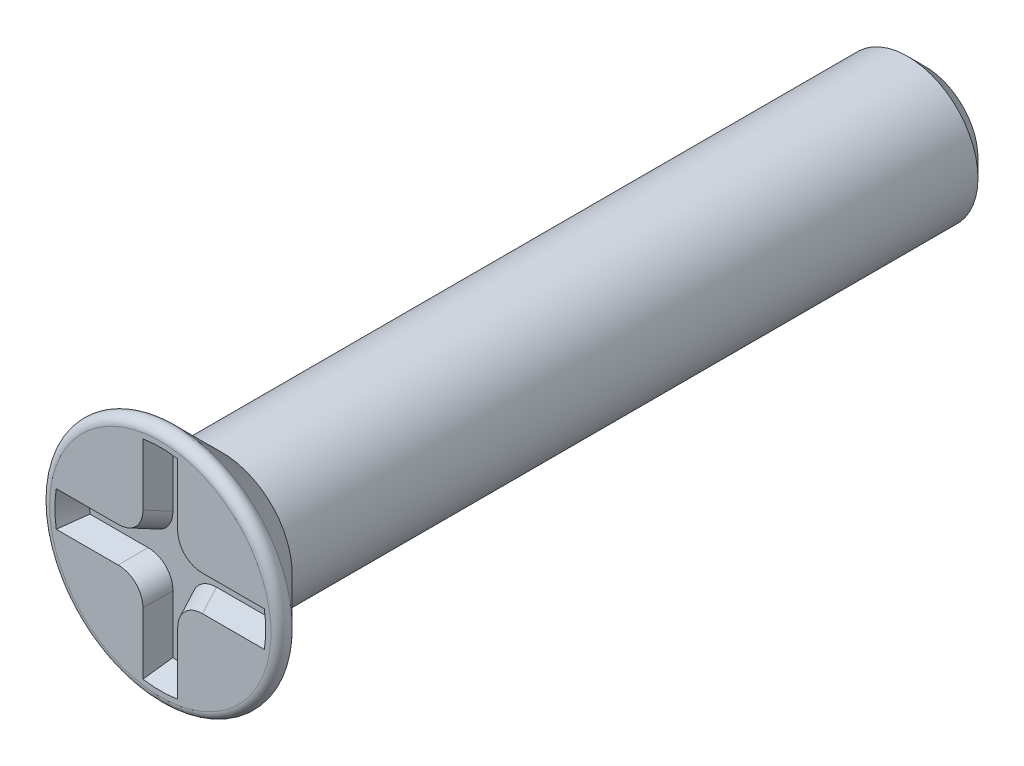
ISO-10303-21;
HEADER;
FILE_DESCRIPTION(('STEP AP214'),'2;1');
FILE_NAME('part.step','',(''),(''),'','','');
FILE_SCHEMA(('AUTOMOTIVE_DESIGN { 1 0 10303 214 1 1 1 1 }'));
ENDSEC;
DATA;
#1=APPLICATION_CONTEXT('core data for automotive mechanical design processes');
#2=APPLICATION_PROTOCOL_DEFINITION('international standard','automotive_design',2000,#1);
#3=PRODUCT_CONTEXT('',#1,'mechanical');
#4=PRODUCT('Part','Part','',(#3));
#5=PRODUCT_RELATED_PRODUCT_CATEGORY('part','',(#4));
#6=PRODUCT_DEFINITION_FORMATION('','',#4);
#7=PRODUCT_DEFINITION_CONTEXT('part definition',#1,'design');
#8=PRODUCT_DEFINITION('design','',#6,#7);
#9=PRODUCT_DEFINITION_SHAPE('','',#8);
#10=(LENGTH_UNIT() NAMED_UNIT(*) SI_UNIT(.MILLI.,.METRE.));
#11=(NAMED_UNIT(*) PLANE_ANGLE_UNIT() SI_UNIT($,.RADIAN.));
#12=(NAMED_UNIT(*) SI_UNIT($,.STERADIAN.) SOLID_ANGLE_UNIT());
#13=UNCERTAINTY_MEASURE_WITH_UNIT(LENGTH_MEASURE(1.E-05),#10,'distance_accuracy_value','');
#14=(GEOMETRIC_REPRESENTATION_CONTEXT(3) GLOBAL_UNCERTAINTY_ASSIGNED_CONTEXT((#13)) GLOBAL_UNIT_ASSIGNED_CONTEXT((#10,
#11,#12)) REPRESENTATION_CONTEXT('',''));
#15=CARTESIAN_POINT('',(0.,0.,0.));
#16=DIRECTION('',(0.,0.,1.));
#17=DIRECTION('',(1.,0.,0.));
#18=AXIS2_PLACEMENT_3D('',#15,#16,#17);
#19=CARTESIAN_POINT('',(0.,0.,8.45));
#20=DIRECTION('',(0.,0.,1.));
#21=DIRECTION('',(1.,0.,0.));
#22=AXIS2_PLACEMENT_3D('',#19,#20,#21);
#23=PLANE('',#22);
#24=DIRECTION('',(1.,0.,0.));
#25=VECTOR('',#24,1.);
#26=CARTESIAN_POINT('',(0.,-0.109007441433327,8.45));
#27=LINE('',#26,#25);
#28=CARTESIAN_POINT('',(1.05001930911711,-0.109007441430067,8.44999999999104));
#29=VERTEX_POINT('',#28);
#30=CARTESIAN_POINT('',(0.388726954020607,-0.109007441433328,8.45));
#31=VERTEX_POINT('',#30);
#32=EDGE_CURVE('E127',#29,#31,#27,.F.);
#33=ORIENTED_EDGE('',*,*,#32,.F.);
#34=CARTESIAN_POINT('',(0.,0.,8.44999999998208));
#35=DIRECTION('',(0.,0.,1.));
#36=DIRECTION('',(1.,0.,0.));
#37=AXIS2_PLACEMENT_3D('',#34,#35,#36);
#38=CIRCLE('',#37,1.05566243269095);
#39=CARTESIAN_POINT('',(1.0500193091163,0.109007441429529,8.44999999998956));
#40=VERTEX_POINT('',#39);
#41=EDGE_CURVE('E19',#29,#40,#38,.T.);
#42=ORIENTED_EDGE('',*,*,#41,.T.);
#43=DIRECTION('',(1.,0.,0.));
#44=VECTOR('',#43,1.);
#45=CARTESIAN_POINT('',(0.,0.109007441433327,8.45));
#46=LINE('',#45,#44);
#47=CARTESIAN_POINT('',(0.388726954020606,0.109007441433327,8.45));
#48=VERTEX_POINT('',#47);
#49=EDGE_CURVE('E144',#48,#40,#46,.T.);
#50=ORIENTED_EDGE('',*,*,#49,.F.);
#51=CARTESIAN_POINT('',(0.426072499527607,0.428260773176101,8.45));
#52=DIRECTION('',(0.,0.,1.));
#53=DIRECTION('',(-0.707106781186548,-0.707106781186548,0.));
#54=AXIS2_PLACEMENT_3D('',#51,#52,#53);
#55=ELLIPSE('',#54,0.337409809664335,0.3);
#56=CARTESIAN_POINT('',(0.106819167784834,0.3909152276691,8.45));
#57=VERTEX_POINT('',#56);
#58=EDGE_CURVE('E175',#57,#48,#55,.T.);
#59=ORIENTED_EDGE('',*,*,#58,.F.);
#60=DIRECTION('',(0.,1.,0.));
#61=VECTOR('',#60,1.);
#62=CARTESIAN_POINT('',(0.106819167784834,0.,8.45));
#63=LINE('',#62,#61);
#64=CARTESIAN_POINT('',(0.106819167784834,1.05024417979804,8.44999999999104));
#65=VERTEX_POINT('',#64);
#66=EDGE_CURVE('E289',#65,#57,#63,.F.);
#67=ORIENTED_EDGE('',*,*,#66,.F.);
#68=CARTESIAN_POINT('',(0.,0.,8.44999999998208));
#69=DIRECTION('',(0.,0.,1.));
#70=DIRECTION('',(1.,0.,0.));
#71=AXIS2_PLACEMENT_3D('',#68,#69,#70);
#72=CIRCLE('',#71,1.05566243269095);
#73=CARTESIAN_POINT('',(-0.106819167781036,1.05024417979757,8.44999999998956));
#74=VERTEX_POINT('',#73);
#75=EDGE_CURVE('E187',#65,#74,#72,.T.);
#76=ORIENTED_EDGE('',*,*,#75,.T.);
#77=DIRECTION('',(0.,1.,0.));
#78=VECTOR('',#77,1.);
#79=CARTESIAN_POINT('',(-0.106819167784834,0.,8.45));
#80=LINE('',#79,#78);
#81=CARTESIAN_POINT('',(-0.106819167784835,0.3909152276691,8.45));
#82=VERTEX_POINT('',#81);
#83=EDGE_CURVE('E208',#82,#74,#80,.T.);
#84=ORIENTED_EDGE('',*,*,#83,.F.);
#85=CARTESIAN_POINT('',(-0.426072499527609,0.428260773176102,8.45));
#86=DIRECTION('',(0.,0.,1.));
#87=DIRECTION('',(0.707106781186548,-0.707106781186548,0.));
#88=AXIS2_PLACEMENT_3D('',#85,#86,#87);
#89=ELLIPSE('',#88,0.337409809664335,0.3);
#90=CARTESIAN_POINT('',(-0.388726954020607,0.109007441433328,8.45));
#91=VERTEX_POINT('',#90);
#92=EDGE_CURVE('E207',#91,#82,#89,.T.);
#93=ORIENTED_EDGE('',*,*,#92,.F.);
#94=DIRECTION('',(1.,0.,0.));
#95=VECTOR('',#94,1.);
#96=CARTESIAN_POINT('',(0.,0.109007441433327,8.45));
#97=LINE('',#96,#95);
#98=CARTESIAN_POINT('',(-1.05001930911677,0.109007441433327,8.44999999999104));
#99=VERTEX_POINT('',#98);
#100=EDGE_CURVE('E284',#99,#91,#97,.T.);
#101=ORIENTED_EDGE('',*,*,#100,.F.);
#102=CARTESIAN_POINT('',(0.,0.,8.44999999998208));
#103=DIRECTION('',(0.,0.,1.));
#104=DIRECTION('',(1.,0.,0.));
#105=AXIS2_PLACEMENT_3D('',#102,#103,#104);
#106=CIRCLE('',#105,1.05566243269095);
#107=CARTESIAN_POINT('',(-1.0500193091163,-0.109007441429529,8.44999999998956));
#108=VERTEX_POINT('',#107);
#109=EDGE_CURVE('E220',#99,#108,#106,.T.);
#110=ORIENTED_EDGE('',*,*,#109,.T.);
#111=DIRECTION('',(1.,0.,0.));
#112=VECTOR('',#111,1.);
#113=CARTESIAN_POINT('',(0.,-0.109007441433327,8.45));
#114=LINE('',#113,#112);
#115=CARTESIAN_POINT('',(-0.388726954020606,-0.109007441433327,8.45));
#116=VERTEX_POINT('',#115);
#117=EDGE_CURVE('E241',#116,#108,#114,.F.);
#118=ORIENTED_EDGE('',*,*,#117,.F.);
#119=CARTESIAN_POINT('',(-0.426072499527607,-0.428260773176101,8.45));
#120=DIRECTION('',(0.,0.,1.));
#121=DIRECTION('',(0.707106781186548,0.707106781186548,0.));
#122=AXIS2_PLACEMENT_3D('',#119,#120,#121);
#123=ELLIPSE('',#122,0.337409809664335,0.3);
#124=CARTESIAN_POINT('',(-0.106819167784834,-0.3909152276691,8.45));
#125=VERTEX_POINT('',#124);
#126=EDGE_CURVE('E240',#125,#116,#123,.T.);
#127=ORIENTED_EDGE('',*,*,#126,.F.);
#128=DIRECTION('',(0.,1.,0.));
#129=VECTOR('',#128,1.);
#130=CARTESIAN_POINT('',(-0.106819167784834,0.,8.45));
#131=LINE('',#130,#129);
#132=CARTESIAN_POINT('',(-0.106819167784834,-1.05024417979804,8.44999999999104));
#133=VERTEX_POINT('',#132);
#134=EDGE_CURVE('E279',#133,#125,#131,.T.);
#135=ORIENTED_EDGE('',*,*,#134,.F.);
#136=CARTESIAN_POINT('',(0.,0.,8.44999999998208));
#137=DIRECTION('',(0.,0.,1.));
#138=DIRECTION('',(1.,0.,0.));
#139=AXIS2_PLACEMENT_3D('',#136,#137,#138);
#140=CIRCLE('',#139,1.05566243269095);
#141=CARTESIAN_POINT('',(0.106819167781036,-1.05024417979757,8.44999999998956));
#142=VERTEX_POINT('',#141);
#143=EDGE_CURVE('E253',#133,#142,#140,.T.);
#144=ORIENTED_EDGE('',*,*,#143,.T.);
#145=DIRECTION('',(0.,1.,0.));
#146=VECTOR('',#145,1.);
#147=CARTESIAN_POINT('',(0.106819167784834,0.,8.45));
#148=LINE('',#147,#146);
#149=CARTESIAN_POINT('',(0.106819167784835,-0.390915227669101,8.45));
#150=VERTEX_POINT('',#149);
#151=EDGE_CURVE('E270',#150,#142,#148,.F.);
#152=ORIENTED_EDGE('',*,*,#151,.F.);
#153=CARTESIAN_POINT('',(0.426072499527609,-0.428260773176102,8.45));
#154=DIRECTION('',(0.,0.,1.));
#155=DIRECTION('',(-0.707106781186548,0.707106781186548,0.));
#156=AXIS2_PLACEMENT_3D('',#153,#154,#155);
#157=ELLIPSE('',#156,0.337409809664335,0.3);
#158=EDGE_CURVE('E131',#31,#150,#157,.T.);
#159=ORIENTED_EDGE('',*,*,#158,.F.);
#160=EDGE_LOOP('',(#33,#42,#50,#59,#67,#76,#84,#93,#101,#110,#118,#127,#135,#144,#152,#159));
#161=FACE_BOUND('',#160,.T.);
#162=ADVANCED_FACE('F16',(#161),#23,.T.);
#163=CARTESIAN_POINT('',(0.,0.,8.69999999997617));
#164=DIRECTION('',(0.,0.,1.));
#165=DIRECTION('',(1.,0.,0.));
#166=AXIS2_PLACEMENT_3D('',#163,#164,#165);
#167=CONICAL_SURFACE('',#166,1.19999999998299,0.523598775592442);
#168=CARTESIAN_POINT('',(1.05001930912036,0.109007441432251,8.44999999999704));
#169=CARTESIAN_POINT('',(1.07252828087872,0.124119880408902,8.49152108483828));
#170=CARTESIAN_POINT('',(1.09488249591806,0.139258819045269,8.5331149768962));
#171=CARTESIAN_POINT('',(1.13928137793344,0.169589671983378,8.61644831045646));
#172=CARTESIAN_POINT('',(1.16132604539225,0.184781586202456,8.65818775173166));
#173=CARTESIAN_POINT('',(1.18321595661478,0.199999999998583,8.69999999999644));
#174=B_SPLINE_CURVE_WITH_KNOTS('',3,(#168,#169,#170,#171,#172,#173),.UNSPECIFIED.,.F.,.F.,(4,2,
4),(0.,0.148763410307382,0.297526588583393),.UNSPECIFIED.);
#175=CARTESIAN_POINT('',(1.18321595660947,0.199999999994894,8.69999999998631));
#176=VERTEX_POINT('',#175);
#177=EDGE_CURVE('E142',#40,#176,#174,.T.);
#178=ORIENTED_EDGE('',*,*,#177,.F.);
#179=ORIENTED_EDGE('',*,*,#41,.F.);
#180=CARTESIAN_POINT('',(1.18321595661478,-0.199999999998583,8.69999999999644));
#181=CARTESIAN_POINT('',(1.16132604539221,-0.184781586202429,8.65818775173159));
#182=CARTESIAN_POINT('',(1.13928137793337,-0.169589671983324,8.61644831045631));
#183=CARTESIAN_POINT('',(1.09488249591791,-0.139258819045161,8.53311497689591));
#184=CARTESIAN_POINT('',(1.07252828087853,-0.124119880408769,8.49152108483791));
#185=CARTESIAN_POINT('',(1.05001930912013,-0.109007441432091,8.4499999999966));
#186=B_SPLINE_CURVE_WITH_KNOTS('',3,(#180,#181,#182,#183,#184,#185),.UNSPECIFIED.,.F.,.F.,(4,2,
4),(0.,0.148763178276272,0.297526588583918),.UNSPECIFIED.);
#187=CARTESIAN_POINT('',(1.18321595660874,-0.199999999999231,8.69999999998631));
#188=VERTEX_POINT('',#187);
#189=EDGE_CURVE('E139',#188,#29,#186,.T.);
#190=ORIENTED_EDGE('',*,*,#189,.F.);
#191=CARTESIAN_POINT('',(0.,0.,8.69999999997617));
#192=DIRECTION('',(0.,0.,1.));
#193=DIRECTION('',(1.,0.,0.));
#194=AXIS2_PLACEMENT_3D('',#191,#192,#193);
#195=CIRCLE('',#194,1.19999999998299);
#196=EDGE_CURVE('E149',#188,#176,#195,.T.);
#197=ORIENTED_EDGE('',*,*,#196,.T.);
#198=EDGE_LOOP('',(#178,#179,#190,#197));
#199=FACE_BOUND('',#198,.T.);
#200=ADVANCED_FACE('F138',(#199),#167,.F.);
#201=CARTESIAN_POINT('',(0.,0.199999999999878,8.7));
#202=DIRECTION('',(0.,-0.939692620785908,0.342020143325669));
#203=DIRECTION('',(0.,-0.342020143325669,-0.939692620785908));
#204=AXIS2_PLACEMENT_3D('',#201,#202,#203);
#205=PLANE('',#204);
#206=ORIENTED_EDGE('',*,*,#49,.T.);
#207=ORIENTED_EDGE('',*,*,#177,.T.);
#208=DIRECTION('',(-1.,0.,0.));
#209=VECTOR('',#208,1.);
#210=CARTESIAN_POINT('',(0.,0.199999999999878,8.7));
#211=LINE('',#210,#209);
#212=CARTESIAN_POINT('',(0.479719512587157,0.199999999999878,8.7));
#213=VERTEX_POINT('',#212);
#214=EDGE_CURVE('E151',#176,#213,#211,.T.);
#215=ORIENTED_EDGE('',*,*,#214,.T.);
#216=DIRECTION('',(-0.323615577118185,-0.323615577118185,-0.889126490715988));
#217=VECTOR('',#216,1.);
#218=CARTESIAN_POINT('',(0.429250735736703,0.149531223149423,8.56133817521588));
#219=LINE('',#218,#217);
#220=EDGE_CURVE('E178',#48,#213,#219,.F.);
#221=ORIENTED_EDGE('',*,*,#220,.F.);
#222=EDGE_LOOP('',(#206,#207,#215,#221));
#223=FACE_BOUND('',#222,.T.);
#224=ADVANCED_FACE('F167',(#223),#205,.T.);
#225=CARTESIAN_POINT('',(0.429250735736702,0.431439009385196,8.45873213221818));
#226=DIRECTION('',(-0.323615577118185,-0.323615577118185,-0.889126490715988));
#227=DIRECTION('',(-0.939692620785908,0.,0.342020143325669));
#228=AXIS2_PLACEMENT_3D('',#225,#226,#227);
#229=CYLINDRICAL_SURFACE('',#228,0.3);
#230=CARTESIAN_POINT('',(0.517065058094158,0.519253331742652,8.7));
#231=DIRECTION('',(0.,0.,-1.));
#232=DIRECTION('',(-0.707106781186548,-0.707106781186548,0.));
#233=AXIS2_PLACEMENT_3D('',#230,#231,#232);
#234=ELLIPSE('',#233,0.337409809664335,0.3);
#235=CARTESIAN_POINT('',(0.197811726351384,0.481907786235651,8.7));
#236=VERTEX_POINT('',#235);
#237=EDGE_CURVE('E314',#213,#236,#234,.T.);
#238=ORIENTED_EDGE('',*,*,#237,.T.);
#239=DIRECTION('',(0.323615577118185,0.323615577118186,0.889126490715988));
#240=VECTOR('',#239,1.);
#241=CARTESIAN_POINT('',(0.106819167784834,0.3909152276691,8.45));
#242=LINE('',#241,#240);
#243=EDGE_CURVE('E188',#57,#236,#242,.T.);
#244=ORIENTED_EDGE('',*,*,#243,.F.);
#245=ORIENTED_EDGE('',*,*,#58,.T.);
#246=ORIENTED_EDGE('',*,*,#220,.T.);
#247=EDGE_LOOP('',(#238,#244,#245,#246));
#248=FACE_BOUND('',#247,.T.);
#249=ADVANCED_FACE('F522',(#248),#229,.T.);
#250=CARTESIAN_POINT('',(0.197811726351385,0.,8.7));
#251=DIRECTION('',(-0.939692620785908,0.,0.342020143325669));
#252=DIRECTION('',(0.342020143325669,0.,0.939692620785908));
#253=AXIS2_PLACEMENT_3D('',#250,#251,#252);
#254=PLANE('',#253);
#255=DIRECTION('',(0.,1.,0.));
#256=VECTOR('',#255,1.);
#257=CARTESIAN_POINT('',(0.197811726351385,1.5,8.7));
#258=LINE('',#257,#256);
#259=CARTESIAN_POINT('',(0.197811726351385,1.18358376167197,8.69999999998809));
#260=VERTEX_POINT('',#259);
#261=EDGE_CURVE('E313',#236,#260,#258,.T.);
#262=ORIENTED_EDGE('',*,*,#261,.T.);
#263=CARTESIAN_POINT('',(0.197811726346612,1.18358376167207,8.69999999998688));
#264=CARTESIAN_POINT('',(0.182592903416662,1.16167208419918,8.65818662763617));
#265=CARTESIAN_POINT('',(0.167400784709158,1.13960462254414,8.61644662453363));
#266=CARTESIAN_POINT('',(0.137069931769622,1.09515809574519,8.53311329096945));
#267=CARTESIAN_POINT('',(0.121931197622005,1.07277903010884,8.49151996073975));
#268=CARTESIAN_POINT('',(0.106819167781247,1.05024417979788,8.44999999999014));
#269=B_SPLINE_CURVE_WITH_KNOTS('',3,(#263,#264,#265,#266,#267,#268),.UNSPECIFIED.,.F.,.F.,(4,2,
4),(0.,0.148795197313219,0.297590629801958),.UNSPECIFIED.);
#270=EDGE_CURVE('E179',#260,#65,#269,.T.);
#271=ORIENTED_EDGE('',*,*,#270,.T.);
#272=ORIENTED_EDGE('',*,*,#66,.T.);
#273=ORIENTED_EDGE('',*,*,#243,.T.);
#274=EDGE_LOOP('',(#262,#271,#272,#273));
#275=FACE_BOUND('',#274,.T.);
#276=ADVANCED_FACE('F190',(#275),#254,.T.);
#277=CARTESIAN_POINT('',(0.,0.,8.69999999997617));
#278=DIRECTION('',(0.,0.,1.));
#279=DIRECTION('',(1.,0.,0.));
#280=AXIS2_PLACEMENT_3D('',#277,#278,#279);
#281=CONICAL_SURFACE('',#280,1.19999999998299,0.523598775592442);
#282=CARTESIAN_POINT('',(-0.106819167783759,1.05024417980163,8.44999999999704));
#283=CARTESIAN_POINT('',(-0.121931197624678,1.0727790301128,8.49151996074709));
#284=CARTESIAN_POINT('',(-0.137069931772456,1.09515809574936,8.53311329097724));
#285=CARTESIAN_POINT('',(-0.167400784712314,1.13960462254874,8.6164466245423));
#286=CARTESIAN_POINT('',(-0.18259290341998,1.16167208420399,8.65818662764529));
#287=CARTESIAN_POINT('',(-0.197811726350092,1.18358376167708,8.69999999999645));
#288=B_SPLINE_CURVE_WITH_KNOTS('',3,(#282,#283,#284,#285,#286,#287),.UNSPECIFIED.,.F.,.F.,(4,2,
4),(0.,0.148795432490289,0.297590629805057),.UNSPECIFIED.);
#289=CARTESIAN_POINT('',(-0.197811726346402,1.18358376167176,8.69999999998631));
#290=VERTEX_POINT('',#289);
#291=EDGE_CURVE('E201',#74,#290,#288,.T.);
#292=ORIENTED_EDGE('',*,*,#291,.F.);
#293=ORIENTED_EDGE('',*,*,#75,.F.);
#294=ORIENTED_EDGE('',*,*,#270,.F.);
#295=CARTESIAN_POINT('',(0.,0.,8.69999999997617));
#296=DIRECTION('',(0.,0.,1.));
#297=DIRECTION('',(1.,0.,0.));
#298=AXIS2_PLACEMENT_3D('',#295,#296,#297);
#299=CIRCLE('',#298,1.19999999998299);
#300=EDGE_CURVE('E312',#260,#290,#299,.T.);
#301=ORIENTED_EDGE('',*,*,#300,.T.);
#302=EDGE_LOOP('',(#292,#293,#294,#301));
#303=FACE_BOUND('',#302,.T.);
#304=ADVANCED_FACE('F192',(#303),#281,.F.);
#305=CARTESIAN_POINT('',(-0.197811726351385,0.,8.7));
#306=DIRECTION('',(0.939692620785908,0.,0.342020143325669));
#307=DIRECTION('',(0.342020143325669,0.,-0.939692620785908));
#308=AXIS2_PLACEMENT_3D('',#305,#306,#307);
#309=PLANE('',#308);
#310=ORIENTED_EDGE('',*,*,#83,.T.);
#311=ORIENTED_EDGE('',*,*,#291,.T.);
#312=DIRECTION('',(0.,1.,0.));
#313=VECTOR('',#312,1.);
#314=CARTESIAN_POINT('',(-0.197811726351385,1.5,8.7));
#315=LINE('',#314,#313);
#316=CARTESIAN_POINT('',(-0.197811726351386,0.481907786235651,8.7));
#317=VERTEX_POINT('',#316);
#318=EDGE_CURVE('E311',#290,#317,#315,.F.);
#319=ORIENTED_EDGE('',*,*,#318,.T.);
#320=DIRECTION('',(0.323615577118185,-0.323615577118185,-0.889126490715988));
#321=VECTOR('',#320,1.);
#322=CARTESIAN_POINT('',(-0.147572120926683,0.431668180810948,8.56196781853332));
#323=LINE('',#322,#321);
#324=EDGE_CURVE('E211',#82,#317,#323,.F.);
#325=ORIENTED_EDGE('',*,*,#324,.F.);
#326=EDGE_LOOP('',(#310,#311,#319,#325));
#327=FACE_BOUND('',#326,.T.);
#328=ADVANCED_FACE('F196',(#327),#309,.T.);
#329=CARTESIAN_POINT('',(-0.429479907162456,0.431668180810949,8.45936177553562));
#330=DIRECTION('',(0.323615577118185,-0.323615577118185,-0.889126490715988));
#331=DIRECTION('',(-0.939692620785908,0.,-0.342020143325669));
#332=AXIS2_PLACEMENT_3D('',#329,#330,#331);
#333=CYLINDRICAL_SURFACE('',#332,0.3);
#334=CARTESIAN_POINT('',(-0.51706505809416,0.519253331742653,8.7));
#335=DIRECTION('',(0.,0.,-1.));
#336=DIRECTION('',(0.707106781186548,-0.707106781186548,0.));
#337=AXIS2_PLACEMENT_3D('',#334,#335,#336);
#338=ELLIPSE('',#337,0.337409809664335,0.3);
#339=CARTESIAN_POINT('',(-0.479719512587158,0.199999999999878,8.7));
#340=VERTEX_POINT('',#339);
#341=EDGE_CURVE('E309',#317,#340,#338,.T.);
#342=ORIENTED_EDGE('',*,*,#341,.T.);
#343=DIRECTION('',(-0.323615577118186,0.323615577118185,0.889126490715988));
#344=VECTOR('',#343,1.);
#345=CARTESIAN_POINT('',(-0.388726954020607,0.109007441433327,8.45));
#346=LINE('',#345,#344);
#347=EDGE_CURVE('E221',#91,#340,#346,.T.);
#348=ORIENTED_EDGE('',*,*,#347,.F.);
#349=ORIENTED_EDGE('',*,*,#92,.T.);
#350=ORIENTED_EDGE('',*,*,#324,.T.);
#351=EDGE_LOOP('',(#342,#348,#349,#350));
#352=FACE_BOUND('',#351,.T.);
#353=ADVANCED_FACE('F495',(#352),#333,.T.);
#354=CARTESIAN_POINT('',(0.,0.199999999999878,8.7));
#355=DIRECTION('',(0.,-0.939692620785908,0.342020143325669));
#356=DIRECTION('',(0.,-0.342020143325669,-0.939692620785908));
#357=AXIS2_PLACEMENT_3D('',#354,#355,#356);
#358=PLANE('',#357);
#359=DIRECTION('',(-1.,0.,0.));
#360=VECTOR('',#359,1.);
#361=CARTESIAN_POINT('',(0.,0.199999999999878,8.7));
#362=LINE('',#361,#360);
#363=CARTESIAN_POINT('',(-1.18321595660967,0.199999999999878,8.69999999998809));
#364=VERTEX_POINT('',#363);
#365=EDGE_CURVE('E308',#340,#364,#362,.T.);
#366=ORIENTED_EDGE('',*,*,#365,.T.);
#367=CARTESIAN_POINT('',(-1.18321595660977,0.199999999995102,8.69999999998688));
#368=CARTESIAN_POINT('',(-1.16132604538744,0.184781586199136,8.65818775172255));
#369=CARTESIAN_POINT('',(-1.13928137792885,0.16958967198022,8.61644831044778));
#370=CARTESIAN_POINT('',(-1.09488249591389,0.139258819042433,8.53311497688841));
#371=CARTESIAN_POINT('',(-1.07252828087476,0.124119880406228,8.49152108483093));
#372=CARTESIAN_POINT('',(-1.05001930911662,0.109007441429737,8.44999999999014));
#373=B_SPLINE_CURVE_WITH_KNOTS('',3,(#367,#368,#369,#370,#371,#372),.UNSPECIFIED.,.F.,.F.,(4,2,
4),(0.,0.148763178274462,0.297526588580297),.UNSPECIFIED.);
#374=EDGE_CURVE('E212',#364,#99,#373,.T.);
#375=ORIENTED_EDGE('',*,*,#374,.T.);
#376=ORIENTED_EDGE('',*,*,#100,.T.);
#377=ORIENTED_EDGE('',*,*,#347,.T.);
#378=EDGE_LOOP('',(#366,#375,#376,#377));
#379=FACE_BOUND('',#378,.T.);
#380=ADVANCED_FACE('F223',(#379),#358,.T.);
#381=CARTESIAN_POINT('',(0.,0.,8.69999999997617));
#382=DIRECTION('',(0.,0.,1.));
#383=DIRECTION('',(1.,0.,0.));
#384=AXIS2_PLACEMENT_3D('',#381,#382,#383);
#385=CONICAL_SURFACE('',#384,1.19999999998299,0.523598775592442);
#386=CARTESIAN_POINT('',(-1.05001930912036,-0.109007441432251,8.44999999999704));
#387=CARTESIAN_POINT('',(-1.07252828087872,-0.124119880408902,8.49152108483828));
#388=CARTESIAN_POINT('',(-1.09488249591806,-0.139258819045269,8.5331149768962));
#389=CARTESIAN_POINT('',(-1.13928137793344,-0.169589671983378,8.61644831045646));
#390=CARTESIAN_POINT('',(-1.16132604539225,-0.184781586202456,8.65818775173166));
#391=CARTESIAN_POINT('',(-1.18321595661478,-0.199999999998583,8.69999999999644));
#392=B_SPLINE_CURVE_WITH_KNOTS('',3,(#386,#387,#388,#389,#390,#391),.UNSPECIFIED.,.F.,.F.,(4,2,
4),(0.,0.148763410307382,0.297526588583393),.UNSPECIFIED.);
#393=CARTESIAN_POINT('',(-1.18321595660947,-0.199999999994894,8.69999999998631));
#394=VERTEX_POINT('',#393);
#395=EDGE_CURVE('E234',#108,#394,#392,.T.);
#396=ORIENTED_EDGE('',*,*,#395,.F.);
#397=ORIENTED_EDGE('',*,*,#109,.F.);
#398=ORIENTED_EDGE('',*,*,#374,.F.);
#399=CARTESIAN_POINT('',(0.,0.,8.69999999997617));
#400=DIRECTION('',(0.,0.,1.));
#401=DIRECTION('',(1.,0.,0.));
#402=AXIS2_PLACEMENT_3D('',#399,#400,#401);
#403=CIRCLE('',#402,1.19999999998299);
#404=EDGE_CURVE('E306',#364,#394,#403,.T.);
#405=ORIENTED_EDGE('',*,*,#404,.T.);
#406=EDGE_LOOP('',(#396,#397,#398,#405));
#407=FACE_BOUND('',#406,.T.);
#408=ADVANCED_FACE('F225',(#407),#385,.F.);
#409=CARTESIAN_POINT('',(0.,-0.199999999999878,8.7));
#410=DIRECTION('',(0.,0.939692620785908,0.342020143325669));
#411=DIRECTION('',(0.,-0.342020143325669,0.939692620785908));
#412=AXIS2_PLACEMENT_3D('',#409,#410,#411);
#413=PLANE('',#412);
#414=ORIENTED_EDGE('',*,*,#117,.T.);
#415=ORIENTED_EDGE('',*,*,#395,.T.);
#416=DIRECTION('',(-1.,0.,0.));
#417=VECTOR('',#416,1.);
#418=CARTESIAN_POINT('',(0.,-0.199999999999878,8.7));
#419=LINE('',#418,#417);
#420=CARTESIAN_POINT('',(-0.479719512587157,-0.199999999999878,8.7));
#421=VERTEX_POINT('',#420);
#422=EDGE_CURVE('E305',#394,#421,#419,.F.);
#423=ORIENTED_EDGE('',*,*,#422,.T.);
#424=DIRECTION('',(0.323615577118185,0.323615577118185,-0.889126490715988));
#425=VECTOR('',#424,1.);
#426=CARTESIAN_POINT('',(-0.429250735736703,-0.149531223149423,8.56133817521588));
#427=LINE('',#426,#425);
#428=EDGE_CURVE('E244',#116,#421,#427,.F.);
#429=ORIENTED_EDGE('',*,*,#428,.F.);
#430=EDGE_LOOP('',(#414,#415,#423,#429));
#431=FACE_BOUND('',#430,.T.);
#432=ADVANCED_FACE('F229',(#431),#413,.T.);
#433=CARTESIAN_POINT('',(-0.429250735736702,-0.431439009385196,8.45873213221818));
#434=DIRECTION('',(0.323615577118185,0.323615577118185,-0.889126490715988));
#435=DIRECTION('',(-0.939692620785908,0.,-0.342020143325669));
#436=AXIS2_PLACEMENT_3D('',#433,#434,#435);
#437=CYLINDRICAL_SURFACE('',#436,0.3);
#438=CARTESIAN_POINT('',(-0.517065058094158,-0.519253331742652,8.7));
#439=DIRECTION('',(0.,0.,-1.));
#440=DIRECTION('',(0.707106781186548,0.707106781186548,0.));
#441=AXIS2_PLACEMENT_3D('',#438,#439,#440);
#442=ELLIPSE('',#441,0.337409809664335,0.3);
#443=CARTESIAN_POINT('',(-0.197811726351384,-0.481907786235651,8.7));
#444=VERTEX_POINT('',#443);
#445=EDGE_CURVE('E303',#421,#444,#442,.T.);
#446=ORIENTED_EDGE('',*,*,#445,.T.);
#447=DIRECTION('',(-0.323615577118185,-0.323615577118186,0.889126490715988));
#448=VECTOR('',#447,1.);
#449=CARTESIAN_POINT('',(-0.106819167784834,-0.3909152276691,8.45));
#450=LINE('',#449,#448);
#451=EDGE_CURVE('E254',#125,#444,#450,.T.);
#452=ORIENTED_EDGE('',*,*,#451,.F.);
#453=ORIENTED_EDGE('',*,*,#126,.T.);
#454=ORIENTED_EDGE('',*,*,#428,.T.);
#455=EDGE_LOOP('',(#446,#452,#453,#454));
#456=FACE_BOUND('',#455,.T.);
#457=ADVANCED_FACE('F468',(#456),#437,.T.);
#458=CARTESIAN_POINT('',(-0.197811726351385,0.,8.7));
#459=DIRECTION('',(0.939692620785908,0.,0.342020143325669));
#460=DIRECTION('',(0.342020143325669,0.,-0.939692620785908));
#461=AXIS2_PLACEMENT_3D('',#458,#459,#460);
#462=PLANE('',#461);
#463=DIRECTION('',(0.,1.,0.));
#464=VECTOR('',#463,1.);
#465=CARTESIAN_POINT('',(-0.197811726351385,1.5,8.7));
#466=LINE('',#465,#464);
#467=CARTESIAN_POINT('',(-0.197811726351385,-1.18358376167197,8.69999999998809));
#468=VERTEX_POINT('',#467);
#469=EDGE_CURVE('E302',#444,#468,#466,.F.);
#470=ORIENTED_EDGE('',*,*,#469,.T.);
#471=CARTESIAN_POINT('',(-0.197811726346612,-1.18358376167207,8.69999999998688));
#472=CARTESIAN_POINT('',(-0.182592903416662,-1.16167208419918,8.65818662763617));
#473=CARTESIAN_POINT('',(-0.167400784709158,-1.13960462254414,8.61644662453363));
#474=CARTESIAN_POINT('',(-0.137069931769622,-1.09515809574519,8.53311329096945));
#475=CARTESIAN_POINT('',(-0.121931197622005,-1.07277903010884,8.49151996073975));
#476=CARTESIAN_POINT('',(-0.106819167781247,-1.05024417979788,8.44999999999014));
#477=B_SPLINE_CURVE_WITH_KNOTS('',3,(#471,#472,#473,#474,#475,#476),.UNSPECIFIED.,.F.,.F.,(4,2,
4),(0.,0.148795197313219,0.297590629801958),.UNSPECIFIED.);
#478=EDGE_CURVE('E245',#468,#133,#477,.T.);
#479=ORIENTED_EDGE('',*,*,#478,.T.);
#480=ORIENTED_EDGE('',*,*,#134,.T.);
#481=ORIENTED_EDGE('',*,*,#451,.T.);
#482=EDGE_LOOP('',(#470,#479,#480,#481));
#483=FACE_BOUND('',#482,.T.);
#484=ADVANCED_FACE('F255',(#483),#462,.T.);
#485=CARTESIAN_POINT('',(0.,0.,8.69999999997617));
#486=DIRECTION('',(0.,0.,1.));
#487=DIRECTION('',(1.,0.,0.));
#488=AXIS2_PLACEMENT_3D('',#485,#486,#487);
#489=CONICAL_SURFACE('',#488,1.19999999998299,0.523598775592442);
#490=CARTESIAN_POINT('',(0.106819167783759,-1.05024417980163,8.44999999999704));
#491=CARTESIAN_POINT('',(0.121931197624678,-1.0727790301128,8.49151996074709));
#492=CARTESIAN_POINT('',(0.137069931772456,-1.09515809574936,8.53311329097724));
#493=CARTESIAN_POINT('',(0.167400784712314,-1.13960462254874,8.6164466245423));
#494=CARTESIAN_POINT('',(0.18259290341998,-1.16167208420399,8.65818662764529));
#495=CARTESIAN_POINT('',(0.197811726350092,-1.18358376167708,8.69999999999645));
#496=B_SPLINE_CURVE_WITH_KNOTS('',3,(#490,#491,#492,#493,#494,#495),.UNSPECIFIED.,.F.,.F.,(4,2,
4),(0.,0.148795432490289,0.297590629805057),.UNSPECIFIED.);
#497=CARTESIAN_POINT('',(0.197811726346402,-1.18358376167176,8.69999999998631));
#498=VERTEX_POINT('',#497);
#499=EDGE_CURVE('E265',#142,#498,#496,.T.);
#500=ORIENTED_EDGE('',*,*,#499,.F.);
#501=ORIENTED_EDGE('',*,*,#143,.F.);
#502=ORIENTED_EDGE('',*,*,#478,.F.);
#503=CARTESIAN_POINT('',(0.,0.,8.69999999997617));
#504=DIRECTION('',(0.,0.,1.));
#505=DIRECTION('',(1.,0.,0.));
#506=AXIS2_PLACEMENT_3D('',#503,#504,#505);
#507=CIRCLE('',#506,1.19999999998299);
#508=EDGE_CURVE('E300',#468,#498,#507,.T.);
#509=ORIENTED_EDGE('',*,*,#508,.T.);
#510=EDGE_LOOP('',(#500,#501,#502,#509));
#511=FACE_BOUND('',#510,.T.);
#512=ADVANCED_FACE('F257',(#511),#489,.F.);
#513=CARTESIAN_POINT('',(0.197811726351385,0.,8.7));
#514=DIRECTION('',(-0.939692620785908,0.,0.342020143325669));
#515=DIRECTION('',(0.342020143325669,0.,0.939692620785908));
#516=AXIS2_PLACEMENT_3D('',#513,#514,#515);
#517=PLANE('',#516);
#518=ORIENTED_EDGE('',*,*,#151,.T.);
#519=ORIENTED_EDGE('',*,*,#499,.T.);
#520=DIRECTION('',(0.,1.,0.));
#521=VECTOR('',#520,1.);
#522=CARTESIAN_POINT('',(0.197811726351385,1.5,8.7));
#523=LINE('',#522,#521);
#524=CARTESIAN_POINT('',(0.197811726351386,-0.481907786235651,8.7));
#525=VERTEX_POINT('',#524);
#526=EDGE_CURVE('E299',#498,#525,#523,.T.);
#527=ORIENTED_EDGE('',*,*,#526,.T.);
#528=DIRECTION('',(-0.323615577118185,0.323615577118185,-0.889126490715988));
#529=VECTOR('',#528,1.);
#530=CARTESIAN_POINT('',(0.147572120926683,-0.431668180810949,8.56196781853332));
#531=LINE('',#530,#529);
#532=EDGE_CURVE('E135',#150,#525,#531,.F.);
#533=ORIENTED_EDGE('',*,*,#532,.F.);
#534=EDGE_LOOP('',(#518,#519,#527,#533));
#535=FACE_BOUND('',#534,.T.);
#536=ADVANCED_FACE('F261',(#535),#517,.T.);
#537=CARTESIAN_POINT('',(0.429479907162456,-0.431668180810949,8.45936177553562));
#538=DIRECTION('',(-0.323615577118185,0.323615577118185,-0.889126490715988));
#539=DIRECTION('',(-0.939692620785908,0.,0.342020143325669));
#540=AXIS2_PLACEMENT_3D('',#537,#538,#539);
#541=CYLINDRICAL_SURFACE('',#540,0.3);
#542=CARTESIAN_POINT('',(0.51706505809416,-0.519253331742653,8.7));
#543=DIRECTION('',(0.,0.,-1.));
#544=DIRECTION('',(-0.707106781186548,0.707106781186548,0.));
#545=AXIS2_PLACEMENT_3D('',#542,#543,#544);
#546=ELLIPSE('',#545,0.337409809664335,0.3);
#547=CARTESIAN_POINT('',(0.479719512587158,-0.199999999999878,8.7));
#548=VERTEX_POINT('',#547);
#549=EDGE_CURVE('E34',#525,#548,#546,.T.);
#550=ORIENTED_EDGE('',*,*,#549,.T.);
#551=DIRECTION('',(0.323615577118186,-0.323615577118185,0.889126490715988));
#552=VECTOR('',#551,1.);
#553=CARTESIAN_POINT('',(0.388726954020607,-0.109007441433327,8.45));
#554=LINE('',#553,#552);
#555=EDGE_CURVE('E134',#31,#548,#554,.T.);
#556=ORIENTED_EDGE('',*,*,#555,.F.);
#557=ORIENTED_EDGE('',*,*,#158,.T.);
#558=ORIENTED_EDGE('',*,*,#532,.T.);
#559=EDGE_LOOP('',(#550,#556,#557,#558));
#560=FACE_BOUND('',#559,.T.);
#561=ADVANCED_FACE('F374',(#560),#541,.T.);
#562=CARTESIAN_POINT('',(0.,-0.199999999999878,8.7));
#563=DIRECTION('',(0.,0.939692620785908,0.342020143325669));
#564=DIRECTION('',(0.,-0.342020143325669,0.939692620785908));
#565=AXIS2_PLACEMENT_3D('',#562,#563,#564);
#566=PLANE('',#565);
#567=DIRECTION('',(-1.,0.,0.));
#568=VECTOR('',#567,1.);
#569=CARTESIAN_POINT('',(0.,-0.199999999999878,8.7));
#570=LINE('',#569,#568);
#571=EDGE_CURVE('E147',#548,#188,#570,.F.);
#572=ORIENTED_EDGE('',*,*,#571,.T.);
#573=ORIENTED_EDGE('',*,*,#189,.T.);
#574=ORIENTED_EDGE('',*,*,#32,.T.);
#575=ORIENTED_EDGE('',*,*,#555,.T.);
#576=EDGE_LOOP('',(#572,#573,#574,#575));
#577=FACE_BOUND('',#576,.T.);
#578=ADVANCED_FACE('F145',(#577),#566,.T.);
#579=CARTESIAN_POINT('',(0.,1.5,8.7));
#580=DIRECTION('',(0.,0.,-1.));
#581=DIRECTION('',(-1.,0.,0.));
#582=AXIS2_PLACEMENT_3D('',#579,#580,#581);
#583=PLANE('',#582);
#584=CARTESIAN_POINT('',(0.,0.,8.7));
#585=DIRECTION('',(0.,0.,-1.));
#586=DIRECTION('',(-1.,0.,0.));
#587=AXIS2_PLACEMENT_3D('',#584,#585,#586);
#588=CIRCLE('',#587,1.25857864376269);
#589=CARTESIAN_POINT('',(-1.25857864376269,0.,8.7));
#590=VERTEX_POINT('',#589);
#591=EDGE_CURVE('E297',#590,#590,#588,.T.);
#592=ORIENTED_EDGE('',*,*,#591,.F.);
#593=EDGE_LOOP('',(#592));
#594=FACE_BOUND('',#593,.T.);
#595=ORIENTED_EDGE('',*,*,#549,.F.);
#596=ORIENTED_EDGE('',*,*,#526,.F.);
#597=ORIENTED_EDGE('',*,*,#508,.F.);
#598=ORIENTED_EDGE('',*,*,#469,.F.);
#599=ORIENTED_EDGE('',*,*,#445,.F.);
#600=ORIENTED_EDGE('',*,*,#422,.F.);
#601=ORIENTED_EDGE('',*,*,#404,.F.);
#602=ORIENTED_EDGE('',*,*,#365,.F.);
#603=ORIENTED_EDGE('',*,*,#341,.F.);
#604=ORIENTED_EDGE('',*,*,#318,.F.);
#605=ORIENTED_EDGE('',*,*,#300,.F.);
#606=ORIENTED_EDGE('',*,*,#261,.F.);
#607=ORIENTED_EDGE('',*,*,#237,.F.);
#608=ORIENTED_EDGE('',*,*,#214,.F.);
#609=ORIENTED_EDGE('',*,*,#196,.F.);
#610=ORIENTED_EDGE('',*,*,#571,.F.);
#611=EDGE_LOOP('',(#595,#596,#597,#598,#599,#600,#601,#602,#603,#604,#605,#606,#607,#608,#609,#610));
#612=FACE_BOUND('',#611,.T.);
#613=ADVANCED_FACE('F360',(#594,#612),#583,.F.);
#614=CARTESIAN_POINT('',(0.,0.,0.));
#615=DIRECTION('',(0.,0.,-1.));
#616=DIRECTION('',(-1.,0.,0.));
#617=AXIS2_PLACEMENT_3D('',#614,#615,#616);
#618=PLANE('',#617);
#619=CARTESIAN_POINT('',(0.,0.,-5.6843418860808E-11));
#620=DIRECTION('',(0.,0.,1.));
#621=DIRECTION('',(1.,0.,0.));
#622=AXIS2_PLACEMENT_3D('',#619,#620,#621);
#623=CIRCLE('',#622,0.599999999963075);
#624=CARTESIAN_POINT('',(0.599999999963075,0.,-5.6843418860808E-11));
#625=VERTEX_POINT('',#624);
#626=EDGE_CURVE('E293',#625,#625,#623,.T.);
#627=ORIENTED_EDGE('',*,*,#626,.F.);
#628=EDGE_LOOP('',(#627));
#629=FACE_BOUND('',#628,.T.);
#630=ADVANCED_FACE('F347',(#629),#618,.T.);
#631=CARTESIAN_POINT('',(0.,0.,8.6));
#632=DIRECTION('',(0.,0.,-1.));
#633=DIRECTION('',(-1.,0.,0.));
#634=AXIS2_PLACEMENT_3D('',#631,#632,#633);
#635=TOROIDAL_SURFACE('',#634,1.25857864376269,0.1);
#636=ORIENTED_EDGE('',*,*,#591,.T.);
#637=EDGE_LOOP('',(#636));
#638=FACE_BOUND('',#637,.T.);
#639=CARTESIAN_POINT('',(0.,0.,8.52928932187069));
#640=DIRECTION('',(0.,0.,1.));
#641=DIRECTION('',(1.,0.,0.));
#642=AXIS2_PLACEMENT_3D('',#639,#640,#641);
#643=CIRCLE('',#642,1.32928932185905);
#644=CARTESIAN_POINT('',(1.32928932185905,0.,8.52928932187069));
#645=VERTEX_POINT('',#644);
#646=EDGE_CURVE('E296',#645,#645,#643,.F.);
#647=ORIENTED_EDGE('',*,*,#646,.F.);
#648=EDGE_LOOP('',(#647));
#649=FACE_BOUND('',#648,.T.);
#650=ADVANCED_FACE('F335',(#638,#649),#635,.T.);
#651=CARTESIAN_POINT('',(0.,0.,0.199999999892952));
#652=DIRECTION('',(0.,0.,1.));
#653=DIRECTION('',(1.,0.,0.));
#654=AXIS2_PLACEMENT_3D('',#651,#652,#653);
#655=CONICAL_SURFACE('',#654,0.79999999991287,0.785398163397448);
#656=ORIENTED_EDGE('',*,*,#626,.T.);
#657=EDGE_LOOP('',(#656));
#658=FACE_BOUND('',#657,.T.);
#659=CARTESIAN_POINT('',(0.,0.,0.2));
#660=DIRECTION('',(0.,0.,1.));
#661=DIRECTION('',(1.,0.,0.));
#662=AXIS2_PLACEMENT_3D('',#659,#660,#661);
#663=CIRCLE('',#662,0.8);
#664=CARTESIAN_POINT('',(0.8,0.,0.2));
#665=VERTEX_POINT('',#664);
#666=EDGE_CURVE('E25',#665,#665,#663,.T.);
#667=ORIENTED_EDGE('',*,*,#666,.F.);
#668=EDGE_LOOP('',(#667));
#669=FACE_BOUND('',#668,.T.);
#670=ADVANCED_FACE('F346',(#658,#669),#655,.T.);
#671=CARTESIAN_POINT('',(0.,0.,8.52928932181385));
#672=DIRECTION('',(0.,0.,1.));
#673=DIRECTION('',(1.,0.,0.));
#674=AXIS2_PLACEMENT_3D('',#671,#672,#673);
#675=CONICAL_SURFACE('',#674,1.32928932180221,0.78539816334375);
#676=CARTESIAN_POINT('',(0.,0.,8.));
#677=DIRECTION('',(0.,0.,1.));
#678=DIRECTION('',(1.,0.,0.));
#679=AXIS2_PLACEMENT_3D('',#676,#677,#678);
#680=CIRCLE('',#679,0.8);
#681=CARTESIAN_POINT('',(0.8,0.,8.));
#682=VERTEX_POINT('',#681);
#683=EDGE_CURVE('E11',#682,#682,#680,.F.);
#684=ORIENTED_EDGE('',*,*,#683,.F.);
#685=EDGE_LOOP('',(#684));
#686=FACE_BOUND('',#685,.T.);
#687=ORIENTED_EDGE('',*,*,#646,.T.);
#688=EDGE_LOOP('',(#687));
#689=FACE_BOUND('',#688,.T.);
#690=ADVANCED_FACE('F378',(#686,#689),#675,.T.);
#691=CARTESIAN_POINT('',(0.,0.,8.));
#692=DIRECTION('',(0.,0.,1.));
#693=DIRECTION('',(1.,0.,0.));
#694=AXIS2_PLACEMENT_3D('',#691,#692,#693);
#695=CYLINDRICAL_SURFACE('',#694,0.8);
#696=ORIENTED_EDGE('',*,*,#683,.T.);
#697=EDGE_LOOP('',(#696));
#698=FACE_BOUND('',#697,.T.);
#699=ORIENTED_EDGE('',*,*,#666,.T.);
#700=EDGE_LOOP('',(#699));
#701=FACE_BOUND('',#700,.T.);
#702=ADVANCED_FACE('F376',(#698,#701),#695,.T.);
#703=CLOSED_SHELL('',(#162,#200,#224,#249,#276,#304,#328,#353,#380,#408,#432,#457,#484,#512,
#536,#561,#578,#613,#630,#650,#670,#690,#702));
#704=MANIFOLD_SOLID_BREP('B1',#703);
#705=ADVANCED_BREP_SHAPE_REPRESENTATION('',(#18,#704),#14);
#706=SHAPE_DEFINITION_REPRESENTATION(#9,#705);
ENDSEC;
END-ISO-10303-21;
